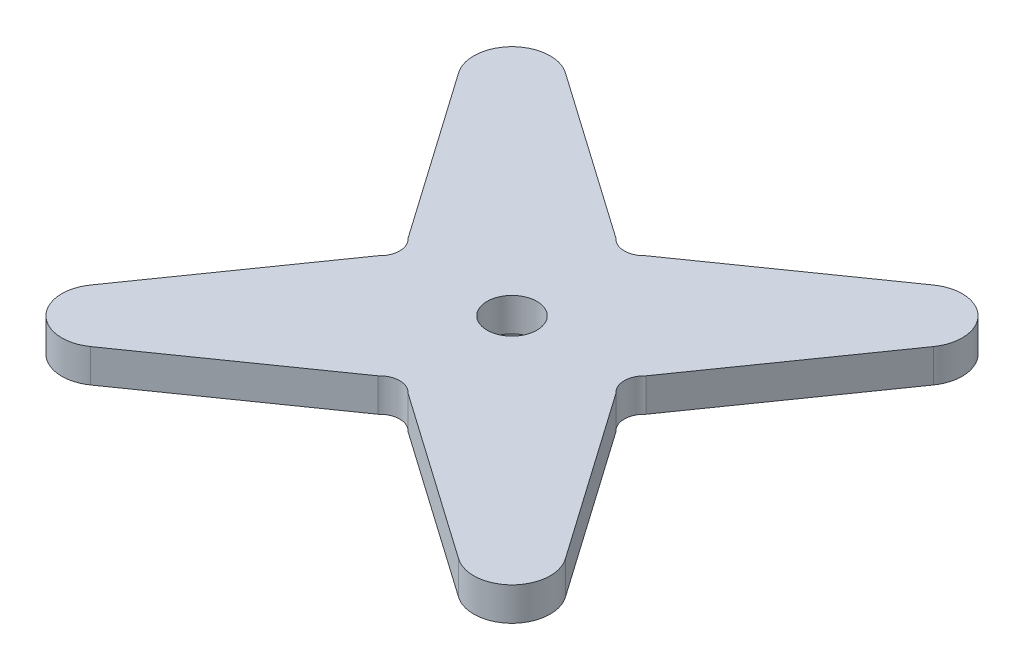
ISO-10303-21;
HEADER;
FILE_DESCRIPTION(('STEP AP214'),'2;1');
FILE_NAME('part.step','',(''),(''),'','','');
FILE_SCHEMA(('AUTOMOTIVE_DESIGN { 1 0 10303 214 1 1 1 1 }'));
ENDSEC;
DATA;
#1=APPLICATION_CONTEXT('core data for automotive mechanical design processes');
#2=APPLICATION_PROTOCOL_DEFINITION('international standard','automotive_design',2000,#1);
#3=PRODUCT_CONTEXT('',#1,'mechanical');
#4=PRODUCT('Part','Part','',(#3));
#5=PRODUCT_RELATED_PRODUCT_CATEGORY('part','',(#4));
#6=PRODUCT_DEFINITION_FORMATION('','',#4);
#7=PRODUCT_DEFINITION_CONTEXT('part definition',#1,'design');
#8=PRODUCT_DEFINITION('design','',#6,#7);
#9=PRODUCT_DEFINITION_SHAPE('','',#8);
#10=(LENGTH_UNIT() NAMED_UNIT(*) SI_UNIT(.MILLI.,.METRE.));
#11=(NAMED_UNIT(*) PLANE_ANGLE_UNIT() SI_UNIT($,.RADIAN.));
#12=(NAMED_UNIT(*) SI_UNIT($,.STERADIAN.) SOLID_ANGLE_UNIT());
#13=UNCERTAINTY_MEASURE_WITH_UNIT(LENGTH_MEASURE(1.E-05),#10,'distance_accuracy_value','');
#14=(GEOMETRIC_REPRESENTATION_CONTEXT(3) GLOBAL_UNCERTAINTY_ASSIGNED_CONTEXT((#13)) GLOBAL_UNIT_ASSIGNED_CONTEXT((#10,
#11,#12)) REPRESENTATION_CONTEXT('',''));
#15=CARTESIAN_POINT('',(0.,0.,0.));
#16=DIRECTION('',(0.,0.,1.));
#17=DIRECTION('',(1.,0.,0.));
#18=AXIS2_PLACEMENT_3D('',#15,#16,#17);
#19=CARTESIAN_POINT('',(-22.9267406034415,2.,-14.2786466448156));
#20=DIRECTION('',(0.,-1.,0.));
#21=DIRECTION('',(0.,0.,-1.));
#22=AXIS2_PLACEMENT_3D('',#19,#20,#21);
#23=CYLINDRICAL_SURFACE('',#22,2.3000000000003);
#24=CARTESIAN_POINT('',(-22.9267406034415,0.,-14.2786466448156));
#25=DIRECTION('',(0.,1.,0.));
#26=DIRECTION('',(0.,0.,1.));
#27=AXIS2_PLACEMENT_3D('',#24,#25,#26);
#28=CIRCLE('',#27,2.3000000000003);
#29=CARTESIAN_POINT('',(-21.6075147998339,0.,-16.1626963466803));
#30=VERTEX_POINT('',#29);
#31=CARTESIAN_POINT('',(-24.8107903053065,0.,-12.9594208412079));
#32=VERTEX_POINT('',#31);
#33=EDGE_CURVE('E180',#30,#32,#28,.T.);
#34=ORIENTED_EDGE('',*,*,#33,.T.);
#35=DIRECTION('',(0.,-1.,0.));
#36=VECTOR('',#35,1.);
#37=CARTESIAN_POINT('',(-24.8107903053065,2.,-12.9594208412079));
#38=LINE('',#37,#36);
#39=CARTESIAN_POINT('',(-24.8107903053065,2.,-12.9594208412079));
#40=VERTEX_POINT('',#39);
#41=EDGE_CURVE('E248',#40,#32,#38,.T.);
#42=ORIENTED_EDGE('',*,*,#41,.F.);
#43=CARTESIAN_POINT('',(-22.9267406034415,2.,-14.2786466448156));
#44=DIRECTION('',(0.,1.,0.));
#45=DIRECTION('',(0.,0.,1.));
#46=AXIS2_PLACEMENT_3D('',#43,#44,#45);
#47=CIRCLE('',#46,2.3000000000003);
#48=CARTESIAN_POINT('',(-21.6075147998339,2.,-16.1626963466803));
#49=VERTEX_POINT('',#48);
#50=EDGE_CURVE('E211',#49,#40,#47,.T.);
#51=ORIENTED_EDGE('',*,*,#50,.F.);
#52=DIRECTION('',(0.,-1.,0.));
#53=VECTOR('',#52,1.);
#54=CARTESIAN_POINT('',(-21.6075147998339,2.,-16.1626963466803));
#55=LINE('',#54,#53);
#56=EDGE_CURVE('E176',#49,#30,#55,.T.);
#57=ORIENTED_EDGE('',*,*,#56,.T.);
#58=EDGE_LOOP('',(#34,#42,#51,#57));
#59=FACE_BOUND('',#58,.T.);
#60=ADVANCED_FACE('F34',(#59),#23,.T.);
#61=CARTESIAN_POINT('',(-24.8107903053065,2.,-12.9594208412079));
#62=DIRECTION('',(0.819152044289004,0.,-0.573576436351029));
#63=DIRECTION('',(-0.573576436351029,0.,-0.819152044289004));
#64=AXIS2_PLACEMENT_3D('',#61,#62,#63);
#65=PLANE('',#64);
#66=DIRECTION('',(0.573576436351029,0.,0.819152044289004));
#67=VECTOR('',#66,1.);
#68=CARTESIAN_POINT('',(-24.8107903053065,0.,-12.9594208412079));
#69=LINE('',#68,#67);
#70=CARTESIAN_POINT('',(-17.6992889051489,0.,-2.80314429162867));
#71=VERTEX_POINT('',#70);
#72=EDGE_CURVE('E183',#32,#71,#69,.T.);
#73=ORIENTED_EDGE('',*,*,#72,.T.);
#74=DIRECTION('',(0.,-1.,0.));
#75=VECTOR('',#74,1.);
#76=CARTESIAN_POINT('',(-17.6992889051489,2.,-2.80314429162867));
#77=LINE('',#76,#75);
#78=CARTESIAN_POINT('',(-17.6992889051489,2.,-2.80314429162867));
#79=VERTEX_POINT('',#78);
#80=EDGE_CURVE('E245',#79,#71,#77,.T.);
#81=ORIENTED_EDGE('',*,*,#80,.F.);
#82=DIRECTION('',(0.573576436351029,0.,0.819152044289004));
#83=VECTOR('',#82,1.);
#84=CARTESIAN_POINT('',(-24.8107903053065,2.,-12.9594208412079));
#85=LINE('',#84,#83);
#86=EDGE_CURVE('E119',#40,#79,#85,.T.);
#87=ORIENTED_EDGE('',*,*,#86,.F.);
#88=ORIENTED_EDGE('',*,*,#41,.T.);
#89=EDGE_LOOP('',(#73,#81,#87,#88));
#90=FACE_BOUND('',#89,.T.);
#91=ADVANCED_FACE('F271',(#90),#65,.F.);
#92=CARTESIAN_POINT('',(-18.5115845835048,2.,-1.90427797405098));
#93=DIRECTION('',(0.,-1.,0.));
#94=DIRECTION('',(0.,0.,-1.));
#95=AXIS2_PLACEMENT_3D('',#92,#93,#94);
#96=CYLINDRICAL_SURFACE('',#95,1.21152173977661);
#97=CARTESIAN_POINT('',(-18.5115845835048,0.,-1.90427797405098));
#98=DIRECTION('',(0.,-1.,0.));
#99=DIRECTION('',(0.,0.,1.));
#100=AXIS2_PLACEMENT_3D('',#97,#98,#99);
#101=CIRCLE('',#100,1.21152173977661);
#102=CARTESIAN_POINT('',(-17.6992889051492,0.,-1.005411656473));
#103=VERTEX_POINT('',#102);
#104=EDGE_CURVE('E186',#71,#103,#101,.T.);
#105=ORIENTED_EDGE('',*,*,#104,.T.);
#106=DIRECTION('',(0.,-1.,0.));
#107=VECTOR('',#106,1.);
#108=CARTESIAN_POINT('',(-17.6992889051492,2.,-1.005411656473));
#109=LINE('',#108,#107);
#110=CARTESIAN_POINT('',(-17.6992889051492,2.,-1.005411656473));
#111=VERTEX_POINT('',#110);
#112=EDGE_CURVE('E242',#111,#103,#109,.T.);
#113=ORIENTED_EDGE('',*,*,#112,.F.);
#114=CARTESIAN_POINT('',(-18.5115845835048,2.,-1.90427797405098));
#115=DIRECTION('',(0.,-1.,0.));
#116=DIRECTION('',(0.,0.,1.));
#117=AXIS2_PLACEMENT_3D('',#114,#115,#116);
#118=CIRCLE('',#117,1.21152173977661);
#119=EDGE_CURVE('E363',#79,#111,#118,.T.);
#120=ORIENTED_EDGE('',*,*,#119,.F.);
#121=ORIENTED_EDGE('',*,*,#80,.T.);
#122=EDGE_LOOP('',(#105,#113,#120,#121));
#123=FACE_BOUND('',#122,.T.);
#124=ADVANCED_FACE('F276',(#123),#96,.F.);
#125=CARTESIAN_POINT('',(-17.6992889051492,2.,-1.005411656473));
#126=DIRECTION('',(0.81915204428897,0.,0.573576436351077));
#127=DIRECTION('',(0.573576436351077,0.,-0.81915204428897));
#128=AXIS2_PLACEMENT_3D('',#125,#126,#127);
#129=PLANE('',#128);
#130=DIRECTION('',(-0.573576436351077,0.,0.81915204428897));
#131=VECTOR('',#130,1.);
#132=CARTESIAN_POINT('',(-17.6992889051492,0.,-1.005411656473));
#133=LINE('',#132,#131);
#134=CARTESIAN_POINT('',(-24.8107903053062,0.,9.15086489310418));
#135=VERTEX_POINT('',#134);
#136=EDGE_CURVE('E188',#103,#135,#133,.T.);
#137=ORIENTED_EDGE('',*,*,#136,.T.);
#138=DIRECTION('',(0.,-1.,0.));
#139=VECTOR('',#138,1.);
#140=CARTESIAN_POINT('',(-24.8107903053062,2.,9.15086489310418));
#141=LINE('',#140,#139);
#142=CARTESIAN_POINT('',(-24.8107903053062,2.,9.15086489310418));
#143=VERTEX_POINT('',#142);
#144=EDGE_CURVE('E239',#143,#135,#141,.T.);
#145=ORIENTED_EDGE('',*,*,#144,.F.);
#146=DIRECTION('',(-0.573576436351077,0.,0.81915204428897));
#147=VECTOR('',#146,1.);
#148=CARTESIAN_POINT('',(-17.6992889051492,2.,-1.005411656473));
#149=LINE('',#148,#147);
#150=EDGE_CURVE('E365',#111,#143,#149,.T.);
#151=ORIENTED_EDGE('',*,*,#150,.F.);
#152=ORIENTED_EDGE('',*,*,#112,.T.);
#153=EDGE_LOOP('',(#137,#145,#151,#152));
#154=FACE_BOUND('',#153,.T.);
#155=ADVANCED_FACE('F281',(#154),#129,.F.);
#156=CARTESIAN_POINT('',(-22.9267406034415,2.,10.4700906967117));
#157=DIRECTION('',(0.,-1.,0.));
#158=DIRECTION('',(0.,0.,-1.));
#159=AXIS2_PLACEMENT_3D('',#156,#157,#158);
#160=CYLINDRICAL_SURFACE('',#159,2.3000000000001);
#161=CARTESIAN_POINT('',(-22.9267406034415,0.,10.4700906967117));
#162=DIRECTION('',(0.,1.,0.));
#163=DIRECTION('',(0.,0.,1.));
#164=AXIS2_PLACEMENT_3D('',#161,#162,#163);
#165=CIRCLE('',#164,2.3000000000001);
#166=CARTESIAN_POINT('',(-21.6075147998339,0.,12.3541403985764));
#167=VERTEX_POINT('',#166);
#168=EDGE_CURVE('E190',#135,#167,#165,.T.);
#169=ORIENTED_EDGE('',*,*,#168,.T.);
#170=DIRECTION('',(0.,-1.,0.));
#171=VECTOR('',#170,1.);
#172=CARTESIAN_POINT('',(-21.6075147998339,2.,12.3541403985764));
#173=LINE('',#172,#171);
#174=CARTESIAN_POINT('',(-21.6075147998339,2.,12.3541403985764));
#175=VERTEX_POINT('',#174);
#176=EDGE_CURVE('E236',#175,#167,#173,.T.);
#177=ORIENTED_EDGE('',*,*,#176,.F.);
#178=CARTESIAN_POINT('',(-22.9267406034415,2.,10.4700906967117));
#179=DIRECTION('',(0.,1.,0.));
#180=DIRECTION('',(0.,0.,1.));
#181=AXIS2_PLACEMENT_3D('',#178,#179,#180);
#182=CIRCLE('',#181,2.3000000000001);
#183=EDGE_CURVE('E367',#143,#175,#182,.T.);
#184=ORIENTED_EDGE('',*,*,#183,.F.);
#185=ORIENTED_EDGE('',*,*,#144,.T.);
#186=EDGE_LOOP('',(#169,#177,#184,#185));
#187=FACE_BOUND('',#186,.T.);
#188=ADVANCED_FACE('F285',(#187),#160,.T.);
#189=CARTESIAN_POINT('',(-21.6075147998339,2.,12.3541403985764));
#190=DIRECTION('',(-0.573576436351118,0.,-0.819152044288942));
#191=DIRECTION('',(-0.819152044288942,0.,0.573576436351118));
#192=AXIS2_PLACEMENT_3D('',#189,#190,#191);
#193=PLANE('',#192);
#194=DIRECTION('',(0.819152044288942,0.,-0.573576436351118));
#195=VECTOR('',#194,1.);
#196=CARTESIAN_POINT('',(-21.6075147998339,0.,12.3541403985764));
#197=LINE('',#196,#195);
#198=CARTESIAN_POINT('',(-11.4512382502561,0.,5.24263899841817));
#199=VERTEX_POINT('',#198);
#200=EDGE_CURVE('E192',#167,#199,#197,.T.);
#201=ORIENTED_EDGE('',*,*,#200,.T.);
#202=DIRECTION('',(0.,-1.,0.));
#203=VECTOR('',#202,1.);
#204=CARTESIAN_POINT('',(-11.4512382502561,2.,5.24263899841817));
#205=LINE('',#204,#203);
#206=CARTESIAN_POINT('',(-11.4512382502561,2.,5.24263899841817));
#207=VERTEX_POINT('',#206);
#208=EDGE_CURVE('E233',#207,#199,#205,.T.);
#209=ORIENTED_EDGE('',*,*,#208,.F.);
#210=DIRECTION('',(0.819152044288942,0.,-0.573576436351118));
#211=VECTOR('',#210,1.);
#212=CARTESIAN_POINT('',(-21.6075147998339,2.,12.3541403985764));
#213=LINE('',#212,#211);
#214=EDGE_CURVE('E369',#175,#207,#213,.T.);
#215=ORIENTED_EDGE('',*,*,#214,.F.);
#216=ORIENTED_EDGE('',*,*,#176,.T.);
#217=EDGE_LOOP('',(#201,#209,#215,#216));
#218=FACE_BOUND('',#217,.T.);
#219=ADVANCED_FACE('F289',(#218),#193,.F.);
#220=CARTESIAN_POINT('',(-10.5523719326788,2.,6.05493467677551));
#221=DIRECTION('',(0.,-1.,0.));
#222=DIRECTION('',(0.,0.,-1.));
#223=AXIS2_PLACEMENT_3D('',#220,#221,#222);
#224=CYLINDRICAL_SURFACE('',#223,1.21152173977735);
#225=CARTESIAN_POINT('',(-10.5523719326788,0.,6.05493467677551));
#226=DIRECTION('',(0.,-1.,0.));
#227=DIRECTION('',(0.,0.,1.));
#228=AXIS2_PLACEMENT_3D('',#225,#226,#227);
#229=CIRCLE('',#228,1.21152173977735);
#230=CARTESIAN_POINT('',(-9.65350561510165,0.,5.24263899841785));
#231=VERTEX_POINT('',#230);
#232=EDGE_CURVE('E194',#199,#231,#229,.T.);
#233=ORIENTED_EDGE('',*,*,#232,.T.);
#234=DIRECTION('',(0.,-1.,0.));
#235=VECTOR('',#234,1.);
#236=CARTESIAN_POINT('',(-9.65350561510165,2.,5.24263899841785));
#237=LINE('',#236,#235);
#238=CARTESIAN_POINT('',(-9.65350561510165,2.,5.24263899841785));
#239=VERTEX_POINT('',#238);
#240=EDGE_CURVE('E230',#239,#231,#237,.T.);
#241=ORIENTED_EDGE('',*,*,#240,.F.);
#242=CARTESIAN_POINT('',(-10.5523719326788,2.,6.05493467677551));
#243=DIRECTION('',(0.,-1.,0.));
#244=DIRECTION('',(0.,0.,1.));
#245=AXIS2_PLACEMENT_3D('',#242,#243,#244);
#246=CIRCLE('',#245,1.21152173977735);
#247=EDGE_CURVE('E371',#207,#239,#246,.T.);
#248=ORIENTED_EDGE('',*,*,#247,.F.);
#249=ORIENTED_EDGE('',*,*,#208,.T.);
#250=EDGE_LOOP('',(#233,#241,#248,#249));
#251=FACE_BOUND('',#250,.T.);
#252=ADVANCED_FACE('F293',(#251),#224,.F.);
#253=CARTESIAN_POINT('',(-9.65350561510165,2.,5.24263899841785));
#254=DIRECTION('',(0.573576436351051,0.,-0.819152044288989));
#255=DIRECTION('',(-0.819152044288989,0.,-0.573576436351051));
#256=AXIS2_PLACEMENT_3D('',#253,#254,#255);
#257=PLANE('',#256);
#258=DIRECTION('',(0.819152044288989,0.,0.573576436351051));
#259=VECTOR('',#258,1.);
#260=CARTESIAN_POINT('',(-9.65350561510165,0.,5.24263899841785));
#261=LINE('',#260,#259);
#262=CARTESIAN_POINT('',(0.502770934478412,0.,12.3541403985764));
#263=VERTEX_POINT('',#262);
#264=EDGE_CURVE('E196',#231,#263,#261,.T.);
#265=ORIENTED_EDGE('',*,*,#264,.T.);
#266=DIRECTION('',(0.,-1.,0.));
#267=VECTOR('',#266,1.);
#268=CARTESIAN_POINT('',(0.502770934478412,2.,12.3541403985764));
#269=LINE('',#268,#267);
#270=CARTESIAN_POINT('',(0.502770934478412,2.,12.3541403985764));
#271=VERTEX_POINT('',#270);
#272=EDGE_CURVE('E227',#271,#263,#269,.T.);
#273=ORIENTED_EDGE('',*,*,#272,.F.);
#274=DIRECTION('',(0.819152044288989,0.,0.573576436351051));
#275=VECTOR('',#274,1.);
#276=CARTESIAN_POINT('',(-9.65350561510165,2.,5.24263899841785));
#277=LINE('',#276,#275);
#278=EDGE_CURVE('E373',#239,#271,#277,.T.);
#279=ORIENTED_EDGE('',*,*,#278,.F.);
#280=ORIENTED_EDGE('',*,*,#240,.T.);
#281=EDGE_LOOP('',(#265,#273,#279,#280));
#282=FACE_BOUND('',#281,.T.);
#283=ADVANCED_FACE('F297',(#282),#257,.F.);
#284=CARTESIAN_POINT('',(1.82199673808582,2.,10.4700906967117));
#285=DIRECTION('',(0.,-1.,0.));
#286=DIRECTION('',(0.,0.,-1.));
#287=AXIS2_PLACEMENT_3D('',#284,#285,#286);
#288=CYLINDRICAL_SURFACE('',#287,2.29999999999999);
#289=CARTESIAN_POINT('',(1.82199673808582,0.,10.4700906967117));
#290=DIRECTION('',(0.,1.,0.));
#291=DIRECTION('',(0.,0.,1.));
#292=AXIS2_PLACEMENT_3D('',#289,#290,#291);
#293=CIRCLE('',#292,2.29999999999999);
#294=CARTESIAN_POINT('',(3.70604643995049,0.,9.15086489310432));
#295=VERTEX_POINT('',#294);
#296=EDGE_CURVE('E198',#263,#295,#293,.T.);
#297=ORIENTED_EDGE('',*,*,#296,.T.);
#298=DIRECTION('',(0.,-1.,0.));
#299=VECTOR('',#298,1.);
#300=CARTESIAN_POINT('',(3.70604643995049,2.,9.15086489310432));
#301=LINE('',#300,#299);
#302=CARTESIAN_POINT('',(3.70604643995049,2.,9.15086489310432));
#303=VERTEX_POINT('',#302);
#304=EDGE_CURVE('E224',#303,#295,#301,.T.);
#305=ORIENTED_EDGE('',*,*,#304,.F.);
#306=CARTESIAN_POINT('',(1.82199673808582,2.,10.4700906967117));
#307=DIRECTION('',(0.,1.,0.));
#308=DIRECTION('',(0.,0.,1.));
#309=AXIS2_PLACEMENT_3D('',#306,#307,#308);
#310=CIRCLE('',#309,2.29999999999999);
#311=EDGE_CURVE('E375',#271,#303,#310,.T.);
#312=ORIENTED_EDGE('',*,*,#311,.F.);
#313=ORIENTED_EDGE('',*,*,#272,.T.);
#314=EDGE_LOOP('',(#297,#305,#312,#313));
#315=FACE_BOUND('',#314,.T.);
#316=ADVANCED_FACE('F301',(#315),#288,.T.);
#317=CARTESIAN_POINT('',(3.70604643995049,2.,9.15086489310432));
#318=DIRECTION('',(-0.819152044288939,0.,0.573576436351121));
#319=DIRECTION('',(0.573576436351121,0.,0.819152044288939));
#320=AXIS2_PLACEMENT_3D('',#317,#318,#319);
#321=PLANE('',#320);
#322=DIRECTION('',(-0.573576436351121,0.,-0.819152044288939));
#323=VECTOR('',#322,1.);
#324=CARTESIAN_POINT('',(3.70604643995049,0.,9.15086489310432));
#325=LINE('',#324,#323);
#326=CARTESIAN_POINT('',(-3.40545496020805,0.,-1.00541165647387));
#327=VERTEX_POINT('',#326);
#328=EDGE_CURVE('E200',#295,#327,#325,.T.);
#329=ORIENTED_EDGE('',*,*,#328,.T.);
#330=DIRECTION('',(0.,-1.,0.));
#331=VECTOR('',#330,1.);
#332=CARTESIAN_POINT('',(-3.40545496020805,2.,-1.00541165647387));
#333=LINE('',#332,#331);
#334=CARTESIAN_POINT('',(-3.40545496020805,2.,-1.00541165647387));
#335=VERTEX_POINT('',#334);
#336=EDGE_CURVE('E221',#335,#327,#333,.T.);
#337=ORIENTED_EDGE('',*,*,#336,.F.);
#338=DIRECTION('',(-0.573576436351121,0.,-0.819152044288939));
#339=VECTOR('',#338,1.);
#340=CARTESIAN_POINT('',(3.70604643995049,2.,9.15086489310432));
#341=LINE('',#340,#339);
#342=EDGE_CURVE('E377',#303,#335,#341,.T.);
#343=ORIENTED_EDGE('',*,*,#342,.F.);
#344=ORIENTED_EDGE('',*,*,#304,.T.);
#345=EDGE_LOOP('',(#329,#337,#343,#344));
#346=FACE_BOUND('',#345,.T.);
#347=ADVANCED_FACE('F305',(#346),#321,.F.);
#348=CARTESIAN_POINT('',(-2.59315928185227,2.,-1.90427797405099));
#349=DIRECTION('',(0.,-1.,0.));
#350=DIRECTION('',(0.,0.,-1.));
#351=AXIS2_PLACEMENT_3D('',#348,#349,#350);
#352=CYLINDRICAL_SURFACE('',#351,1.2115217397761);
#353=CARTESIAN_POINT('',(-2.59315928185227,0.,-1.90427797405099));
#354=DIRECTION('',(0.,-1.,0.));
#355=DIRECTION('',(0.,0.,1.));
#356=AXIS2_PLACEMENT_3D('',#353,#354,#355);
#357=CIRCLE('',#356,1.2115217397761);
#358=CARTESIAN_POINT('',(-3.40545496020802,0.,-2.80314429162812));
#359=VERTEX_POINT('',#358);
#360=EDGE_CURVE('E202',#327,#359,#357,.T.);
#361=ORIENTED_EDGE('',*,*,#360,.T.);
#362=DIRECTION('',(0.,-1.,0.));
#363=VECTOR('',#362,1.);
#364=CARTESIAN_POINT('',(-3.40545496020802,2.,-2.80314429162812));
#365=LINE('',#364,#363);
#366=CARTESIAN_POINT('',(-3.40545496020802,2.,-2.80314429162812));
#367=VERTEX_POINT('',#366);
#368=EDGE_CURVE('E218',#367,#359,#365,.T.);
#369=ORIENTED_EDGE('',*,*,#368,.F.);
#370=CARTESIAN_POINT('',(-2.59315928185227,2.,-1.90427797405099));
#371=DIRECTION('',(0.,-1.,0.));
#372=DIRECTION('',(0.,0.,1.));
#373=AXIS2_PLACEMENT_3D('',#370,#371,#372);
#374=CIRCLE('',#373,1.2115217397761);
#375=EDGE_CURVE('E379',#335,#367,#374,.T.);
#376=ORIENTED_EDGE('',*,*,#375,.F.);
#377=ORIENTED_EDGE('',*,*,#336,.T.);
#378=EDGE_LOOP('',(#361,#369,#376,#377));
#379=FACE_BOUND('',#378,.T.);
#380=ADVANCED_FACE('F309',(#379),#352,.F.);
#381=CARTESIAN_POINT('',(-3.40545496020802,2.,-2.80314429162812));
#382=DIRECTION('',(-0.819152044288989,0.,-0.57357643635105));
#383=DIRECTION('',(-0.57357643635105,0.,0.819152044288989));
#384=AXIS2_PLACEMENT_3D('',#381,#382,#383);
#385=PLANE('',#384);
#386=DIRECTION('',(0.57357643635105,0.,-0.819152044288989));
#387=VECTOR('',#386,1.);
#388=CARTESIAN_POINT('',(-3.40545496020802,0.,-2.80314429162812));
#389=LINE('',#388,#387);
#390=CARTESIAN_POINT('',(3.70604643995049,0.,-12.9594208412082));
#391=VERTEX_POINT('',#390);
#392=EDGE_CURVE('E204',#359,#391,#389,.T.);
#393=ORIENTED_EDGE('',*,*,#392,.T.);
#394=DIRECTION('',(0.,-1.,0.));
#395=VECTOR('',#394,1.);
#396=CARTESIAN_POINT('',(3.70604643995049,2.,-12.9594208412082));
#397=LINE('',#396,#395);
#398=CARTESIAN_POINT('',(3.70604643995049,2.,-12.9594208412082));
#399=VERTEX_POINT('',#398);
#400=EDGE_CURVE('E215',#399,#391,#397,.T.);
#401=ORIENTED_EDGE('',*,*,#400,.F.);
#402=DIRECTION('',(0.57357643635105,0.,-0.819152044288989));
#403=VECTOR('',#402,1.);
#404=CARTESIAN_POINT('',(-3.40545496020802,2.,-2.80314429162812));
#405=LINE('',#404,#403);
#406=EDGE_CURVE('E381',#367,#399,#405,.T.);
#407=ORIENTED_EDGE('',*,*,#406,.F.);
#408=ORIENTED_EDGE('',*,*,#368,.T.);
#409=EDGE_LOOP('',(#393,#401,#407,#408));
#410=FACE_BOUND('',#409,.T.);
#411=ADVANCED_FACE('F313',(#410),#385,.F.);
#412=CARTESIAN_POINT('',(1.82199673808582,2.,-14.2786466448156));
#413=DIRECTION('',(0.,-1.,0.));
#414=DIRECTION('',(0.,0.,-1.));
#415=AXIS2_PLACEMENT_3D('',#412,#413,#414);
#416=CYLINDRICAL_SURFACE('',#415,2.29999999999999);
#417=CARTESIAN_POINT('',(1.82199673808582,0.,-14.2786466448156));
#418=DIRECTION('',(0.,1.,0.));
#419=DIRECTION('',(0.,0.,1.));
#420=AXIS2_PLACEMENT_3D('',#417,#418,#419);
#421=CIRCLE('',#420,2.29999999999999);
#422=CARTESIAN_POINT('',(0.50277093447842,0.,-16.1626963466802));
#423=VERTEX_POINT('',#422);
#424=EDGE_CURVE('E206',#391,#423,#421,.T.);
#425=ORIENTED_EDGE('',*,*,#424,.T.);
#426=DIRECTION('',(0.,-1.,0.));
#427=VECTOR('',#426,1.);
#428=CARTESIAN_POINT('',(0.50277093447842,2.,-16.1626963466802));
#429=LINE('',#428,#427);
#430=CARTESIAN_POINT('',(0.50277093447842,2.,-16.1626963466802));
#431=VERTEX_POINT('',#430);
#432=EDGE_CURVE('E171',#431,#423,#429,.T.);
#433=ORIENTED_EDGE('',*,*,#432,.F.);
#434=CARTESIAN_POINT('',(1.82199673808582,2.,-14.2786466448156));
#435=DIRECTION('',(0.,1.,0.));
#436=DIRECTION('',(0.,0.,1.));
#437=AXIS2_PLACEMENT_3D('',#434,#435,#436);
#438=CIRCLE('',#437,2.29999999999999);
#439=EDGE_CURVE('E162',#399,#431,#438,.T.);
#440=ORIENTED_EDGE('',*,*,#439,.F.);
#441=ORIENTED_EDGE('',*,*,#400,.T.);
#442=EDGE_LOOP('',(#425,#433,#440,#441));
#443=FACE_BOUND('',#442,.T.);
#444=ADVANCED_FACE('F317',(#443),#416,.T.);
#445=CARTESIAN_POINT('',(0.50277093447842,2.,-16.1626963466802));
#446=DIRECTION('',(0.573576436351041,0.,0.819152044288995));
#447=DIRECTION('',(0.819152044288995,0.,-0.573576436351041));
#448=AXIS2_PLACEMENT_3D('',#445,#446,#447);
#449=PLANE('',#448);
#450=DIRECTION('',(-0.819152044288995,0.,0.573576436351041));
#451=VECTOR('',#450,1.);
#452=CARTESIAN_POINT('',(0.50277093447842,0.,-16.1626963466802));
#453=LINE('',#452,#451);
#454=CARTESIAN_POINT('',(-9.65350561510201,0.,-9.05119494652163));
#455=VERTEX_POINT('',#454);
#456=EDGE_CURVE('E170',#423,#455,#453,.T.);
#457=ORIENTED_EDGE('',*,*,#456,.T.);
#458=DIRECTION('',(0.,-1.,0.));
#459=VECTOR('',#458,1.);
#460=CARTESIAN_POINT('',(-9.65350561510201,2.,-9.05119494652163));
#461=LINE('',#460,#459);
#462=CARTESIAN_POINT('',(-9.65350561510201,2.,-9.05119494652163));
#463=VERTEX_POINT('',#462);
#464=EDGE_CURVE('E167',#463,#455,#461,.T.);
#465=ORIENTED_EDGE('',*,*,#464,.F.);
#466=DIRECTION('',(-0.819152044288995,0.,0.573576436351041));
#467=VECTOR('',#466,1.);
#468=CARTESIAN_POINT('',(0.50277093447842,2.,-16.1626963466802));
#469=LINE('',#468,#467);
#470=EDGE_CURVE('E156',#431,#463,#469,.T.);
#471=ORIENTED_EDGE('',*,*,#470,.F.);
#472=ORIENTED_EDGE('',*,*,#432,.T.);
#473=EDGE_LOOP('',(#457,#465,#471,#472));
#474=FACE_BOUND('',#473,.T.);
#475=ADVANCED_FACE('F168',(#474),#449,.F.);
#476=CARTESIAN_POINT('',(-10.5523719326788,2.,-9.86349062487747));
#477=DIRECTION('',(0.,-1.,0.));
#478=DIRECTION('',(0.,0.,-1.));
#479=AXIS2_PLACEMENT_3D('',#476,#477,#478);
#480=CYLINDRICAL_SURFACE('',#479,1.21152173977588);
#481=CARTESIAN_POINT('',(-10.5523719326788,0.,-9.86349062487747));
#482=DIRECTION('',(0.,-1.,0.));
#483=DIRECTION('',(0.,0.,1.));
#484=AXIS2_PLACEMENT_3D('',#481,#482,#483);
#485=CIRCLE('',#484,1.21152173977588);
#486=CARTESIAN_POINT('',(-11.4512382502558,0.,-9.05119494652192));
#487=VERTEX_POINT('',#486);
#488=EDGE_CURVE('E104',#455,#487,#485,.T.);
#489=ORIENTED_EDGE('',*,*,#488,.T.);
#490=DIRECTION('',(0.,-1.,0.));
#491=VECTOR('',#490,1.);
#492=CARTESIAN_POINT('',(-11.4512382502558,2.,-9.05119494652192));
#493=LINE('',#492,#491);
#494=CARTESIAN_POINT('',(-11.4512382502558,2.,-9.05119494652192));
#495=VERTEX_POINT('',#494);
#496=EDGE_CURVE('E172',#495,#487,#493,.T.);
#497=ORIENTED_EDGE('',*,*,#496,.F.);
#498=CARTESIAN_POINT('',(-10.5523719326788,2.,-9.86349062487747));
#499=DIRECTION('',(0.,-1.,0.));
#500=DIRECTION('',(0.,0.,1.));
#501=AXIS2_PLACEMENT_3D('',#498,#499,#500);
#502=CIRCLE('',#501,1.21152173977588);
#503=EDGE_CURVE('E160',#463,#495,#502,.T.);
#504=ORIENTED_EDGE('',*,*,#503,.F.);
#505=ORIENTED_EDGE('',*,*,#464,.T.);
#506=EDGE_LOOP('',(#489,#497,#504,#505));
#507=FACE_BOUND('',#506,.T.);
#508=ADVANCED_FACE('F174',(#507),#480,.F.);
#509=CARTESIAN_POINT('',(-11.4512382502558,2.,-9.05119494652192));
#510=DIRECTION('',(-0.573576436351118,0.,0.819152044288942));
#511=DIRECTION('',(0.819152044288942,0.,0.573576436351118));
#512=AXIS2_PLACEMENT_3D('',#509,#510,#511);
#513=PLANE('',#512);
#514=DIRECTION('',(-0.819152044288942,0.,-0.573576436351118));
#515=VECTOR('',#514,1.);
#516=CARTESIAN_POINT('',(-11.4512382502558,0.,-9.05119494652192));
#517=LINE('',#516,#515);
#518=EDGE_CURVE('E110',#487,#30,#517,.T.);
#519=ORIENTED_EDGE('',*,*,#518,.T.);
#520=ORIENTED_EDGE('',*,*,#56,.F.);
#521=DIRECTION('',(-0.819152044288942,0.,-0.573576436351118));
#522=VECTOR('',#521,1.);
#523=CARTESIAN_POINT('',(-11.4512382502558,2.,-9.05119494652192));
#524=LINE('',#523,#522);
#525=EDGE_CURVE('E51',#495,#49,#524,.T.);
#526=ORIENTED_EDGE('',*,*,#525,.F.);
#527=ORIENTED_EDGE('',*,*,#496,.T.);
#528=EDGE_LOOP('',(#519,#520,#526,#527));
#529=FACE_BOUND('',#528,.T.);
#530=ADVANCED_FACE('F326',(#529),#513,.F.);
#531=CARTESIAN_POINT('',(-22.9267406034415,2.,-14.2786466448156));
#532=DIRECTION('',(0.,1.,0.));
#533=DIRECTION('',(0.,0.,1.));
#534=AXIS2_PLACEMENT_3D('',#531,#532,#533);
#535=PLANE('',#534);
#536=CARTESIAN_POINT('',(-10.5523719326778,2.,-1.90427797405191));
#537=DIRECTION('',(0.,1.,0.));
#538=DIRECTION('',(0.,0.,1.));
#539=AXIS2_PLACEMENT_3D('',#536,#537,#538);
#540=CIRCLE('',#539,1.5);
#541=CARTESIAN_POINT('',(-10.5523719326778,2.,-0.404277974051913));
#542=VERTEX_POINT('',#541);
#543=EDGE_CURVE('E352',#542,#542,#540,.F.);
#544=ORIENTED_EDGE('',*,*,#543,.T.);
#545=EDGE_LOOP('',(#544));
#546=FACE_BOUND('',#545,.T.);
#547=ORIENTED_EDGE('',*,*,#50,.T.);
#548=ORIENTED_EDGE('',*,*,#86,.T.);
#549=ORIENTED_EDGE('',*,*,#119,.T.);
#550=ORIENTED_EDGE('',*,*,#150,.T.);
#551=ORIENTED_EDGE('',*,*,#183,.T.);
#552=ORIENTED_EDGE('',*,*,#214,.T.);
#553=ORIENTED_EDGE('',*,*,#247,.T.);
#554=ORIENTED_EDGE('',*,*,#278,.T.);
#555=ORIENTED_EDGE('',*,*,#311,.T.);
#556=ORIENTED_EDGE('',*,*,#342,.T.);
#557=ORIENTED_EDGE('',*,*,#375,.T.);
#558=ORIENTED_EDGE('',*,*,#406,.T.);
#559=ORIENTED_EDGE('',*,*,#439,.T.);
#560=ORIENTED_EDGE('',*,*,#470,.T.);
#561=ORIENTED_EDGE('',*,*,#503,.T.);
#562=ORIENTED_EDGE('',*,*,#525,.T.);
#563=EDGE_LOOP('',(#547,#548,#549,#550,#551,#552,#553,#554,#555,#556,#557,#558,#559,#560,#561,#562));
#564=FACE_BOUND('',#563,.T.);
#565=ADVANCED_FACE('F158',(#546,#564),#535,.T.);
#566=CARTESIAN_POINT('',(-22.9267406034415,0.,-14.2786466448156));
#567=DIRECTION('',(0.,1.,0.));
#568=DIRECTION('',(0.,0.,1.));
#569=AXIS2_PLACEMENT_3D('',#566,#567,#568);
#570=PLANE('',#569);
#571=CARTESIAN_POINT('',(-10.5523719326778,0.,-1.90427797405191));
#572=DIRECTION('',(0.,1.,0.));
#573=DIRECTION('',(0.,0.,1.));
#574=AXIS2_PLACEMENT_3D('',#571,#572,#573);
#575=CIRCLE('',#574,6.5);
#576=CARTESIAN_POINT('',(-10.5523719326778,0.,4.59572202594809));
#577=VERTEX_POINT('',#576);
#578=EDGE_CURVE('E11',#577,#577,#575,.T.);
#579=ORIENTED_EDGE('',*,*,#578,.T.);
#580=EDGE_LOOP('',(#579));
#581=FACE_BOUND('',#580,.T.);
#582=ORIENTED_EDGE('',*,*,#33,.F.);
#583=ORIENTED_EDGE('',*,*,#518,.F.);
#584=ORIENTED_EDGE('',*,*,#488,.F.);
#585=ORIENTED_EDGE('',*,*,#456,.F.);
#586=ORIENTED_EDGE('',*,*,#424,.F.);
#587=ORIENTED_EDGE('',*,*,#392,.F.);
#588=ORIENTED_EDGE('',*,*,#360,.F.);
#589=ORIENTED_EDGE('',*,*,#328,.F.);
#590=ORIENTED_EDGE('',*,*,#296,.F.);
#591=ORIENTED_EDGE('',*,*,#264,.F.);
#592=ORIENTED_EDGE('',*,*,#232,.F.);
#593=ORIENTED_EDGE('',*,*,#200,.F.);
#594=ORIENTED_EDGE('',*,*,#168,.F.);
#595=ORIENTED_EDGE('',*,*,#136,.F.);
#596=ORIENTED_EDGE('',*,*,#104,.F.);
#597=ORIENTED_EDGE('',*,*,#72,.F.);
#598=EDGE_LOOP('',(#582,#583,#584,#585,#586,#587,#588,#589,#590,#591,#592,#593,#594,#595,#596,#597));
#599=FACE_BOUND('',#598,.T.);
#600=ADVANCED_FACE('F268',(#581,#599),#570,.F.);
#601=CARTESIAN_POINT('',(-10.5523719326778,-3.5,-1.90427797405191));
#602=DIRECTION('',(0.,-1.,0.));
#603=DIRECTION('',(0.,0.,-1.));
#604=AXIS2_PLACEMENT_3D('',#601,#602,#603);
#605=PLANE('',#604);
#606=CARTESIAN_POINT('',(-10.5523719326778,-3.5,-1.90427797405191));
#607=DIRECTION('',(0.,-1.,0.));
#608=DIRECTION('',(0.,0.,-1.));
#609=AXIS2_PLACEMENT_3D('',#606,#607,#608);
#610=CIRCLE('',#609,4.);
#611=CARTESIAN_POINT('',(-10.5523719326778,-3.5,-5.90427797405191));
#612=VERTEX_POINT('',#611);
#613=EDGE_CURVE('E184',#612,#612,#610,.T.);
#614=ORIENTED_EDGE('',*,*,#613,.T.);
#615=EDGE_LOOP('',(#614));
#616=FACE_BOUND('',#615,.T.);
#617=CARTESIAN_POINT('',(-10.5523719326778,-3.5,-1.90427797405191));
#618=DIRECTION('',(0.,-1.,0.));
#619=DIRECTION('',(0.,0.,-1.));
#620=AXIS2_PLACEMENT_3D('',#617,#618,#619);
#621=CIRCLE('',#620,3.);
#622=CARTESIAN_POINT('',(-10.5523719326778,-3.5,-4.90427797405191));
#623=VERTEX_POINT('',#622);
#624=EDGE_CURVE('E347',#623,#623,#621,.T.);
#625=ORIENTED_EDGE('',*,*,#624,.F.);
#626=EDGE_LOOP('',(#625));
#627=FACE_BOUND('',#626,.T.);
#628=ADVANCED_FACE('F330',(#616,#627),#605,.T.);
#629=CARTESIAN_POINT('',(-10.5523719326778,-3.5,-1.90427797405191));
#630=DIRECTION('',(0.,1.,0.));
#631=DIRECTION('',(0.,0.,1.));
#632=AXIS2_PLACEMENT_3D('',#629,#630,#631);
#633=CYLINDRICAL_SURFACE('',#632,4.);
#634=CARTESIAN_POINT('',(-10.5523719326778,-2.5,-1.90427797405191));
#635=DIRECTION('',(0.,1.,0.));
#636=DIRECTION('',(0.,0.,1.));
#637=AXIS2_PLACEMENT_3D('',#634,#635,#636);
#638=CIRCLE('',#637,4.);
#639=CARTESIAN_POINT('',(-10.5523719326778,-2.5,2.09572202594809));
#640=VERTEX_POINT('',#639);
#641=EDGE_CURVE('E43',#640,#640,#638,.F.);
#642=ORIENTED_EDGE('',*,*,#641,.T.);
#643=EDGE_LOOP('',(#642));
#644=FACE_BOUND('',#643,.T.);
#645=ORIENTED_EDGE('',*,*,#613,.F.);
#646=EDGE_LOOP('',(#645));
#647=FACE_BOUND('',#646,.T.);
#648=ADVANCED_FACE('F252',(#644,#647),#633,.T.);
#649=CARTESIAN_POINT('',(-10.5523719326778,-3.5,-1.90427797405191));
#650=DIRECTION('',(0.,1.,0.));
#651=DIRECTION('',(0.,0.,1.));
#652=AXIS2_PLACEMENT_3D('',#649,#650,#651);
#653=CYLINDRICAL_SURFACE('',#652,3.);
#654=ORIENTED_EDGE('',*,*,#624,.T.);
#655=EDGE_LOOP('',(#654));
#656=FACE_BOUND('',#655,.T.);
#657=CARTESIAN_POINT('',(-10.5523719326778,0.,-1.90427797405191));
#658=DIRECTION('',(0.,-1.,0.));
#659=DIRECTION('',(0.,0.,-1.));
#660=AXIS2_PLACEMENT_3D('',#657,#658,#659);
#661=CIRCLE('',#660,3.);
#662=CARTESIAN_POINT('',(-10.5523719326778,0.,-4.90427797405191));
#663=VERTEX_POINT('',#662);
#664=EDGE_CURVE('E350',#663,#663,#661,.T.);
#665=ORIENTED_EDGE('',*,*,#664,.F.);
#666=EDGE_LOOP('',(#665));
#667=FACE_BOUND('',#666,.T.);
#668=ADVANCED_FACE('F265',(#656,#667),#653,.F.);
#669=CARTESIAN_POINT('',(-10.5523719326778,0.,-1.90427797405191));
#670=DIRECTION('',(0.,-1.,0.));
#671=DIRECTION('',(0.,0.,-1.));
#672=AXIS2_PLACEMENT_3D('',#669,#670,#671);
#673=CIRCLE('',#672,1.5);
#674=CARTESIAN_POINT('',(-10.5523719326778,0.,-3.40427797405191));
#675=VERTEX_POINT('',#674);
#676=EDGE_CURVE('E356',#675,#675,#673,.T.);
#677=ORIENTED_EDGE('',*,*,#676,.F.);
#678=EDGE_LOOP('',(#677));
#679=FACE_BOUND('',#678,.T.);
#680=ORIENTED_EDGE('',*,*,#664,.T.);
#681=EDGE_LOOP('',(#680));
#682=FACE_BOUND('',#681,.T.);
#683=ADVANCED_FACE('F257',(#679,#682),#570,.F.);
#684=CARTESIAN_POINT('',(-10.5523719326778,-2.5,-1.90427797405191));
#685=DIRECTION('',(0.,1.,0.));
#686=DIRECTION('',(0.,0.,1.));
#687=AXIS2_PLACEMENT_3D('',#684,#685,#686);
#688=TOROIDAL_SURFACE('',#687,6.5,2.5);
#689=ORIENTED_EDGE('',*,*,#578,.F.);
#690=EDGE_LOOP('',(#689));
#691=FACE_BOUND('',#690,.T.);
#692=ORIENTED_EDGE('',*,*,#641,.F.);
#693=EDGE_LOOP('',(#692));
#694=FACE_BOUND('',#693,.T.);
#695=ADVANCED_FACE('F36',(#691,#694),#688,.F.);
#696=CARTESIAN_POINT('',(-10.5523719326778,6.24264068711929,-1.90427797405191));
#697=DIRECTION('',(0.,-1.,0.));
#698=DIRECTION('',(0.,0.,-1.));
#699=AXIS2_PLACEMENT_3D('',#696,#697,#698);
#700=CYLINDRICAL_SURFACE('',#699,1.5);
#701=ORIENTED_EDGE('',*,*,#676,.T.);
#702=EDGE_LOOP('',(#701));
#703=FACE_BOUND('',#702,.T.);
#704=ORIENTED_EDGE('',*,*,#543,.F.);
#705=EDGE_LOOP('',(#704));
#706=FACE_BOUND('',#705,.T.);
#707=ADVANCED_FACE('F256',(#703,#706),#700,.F.);
#708=CLOSED_SHELL('',(#60,#91,#124,#155,#188,#219,#252,#283,#316,#347,#380,#411,#444,#475,#508,
#530,#565,#600,#628,#648,#668,#683,#695,#707));
#709=MANIFOLD_SOLID_BREP('B2',#708);
#710=ADVANCED_BREP_SHAPE_REPRESENTATION('',(#18,#709),#14);
#711=SHAPE_DEFINITION_REPRESENTATION(#9,#710);
ENDSEC;
END-ISO-10303-21;
